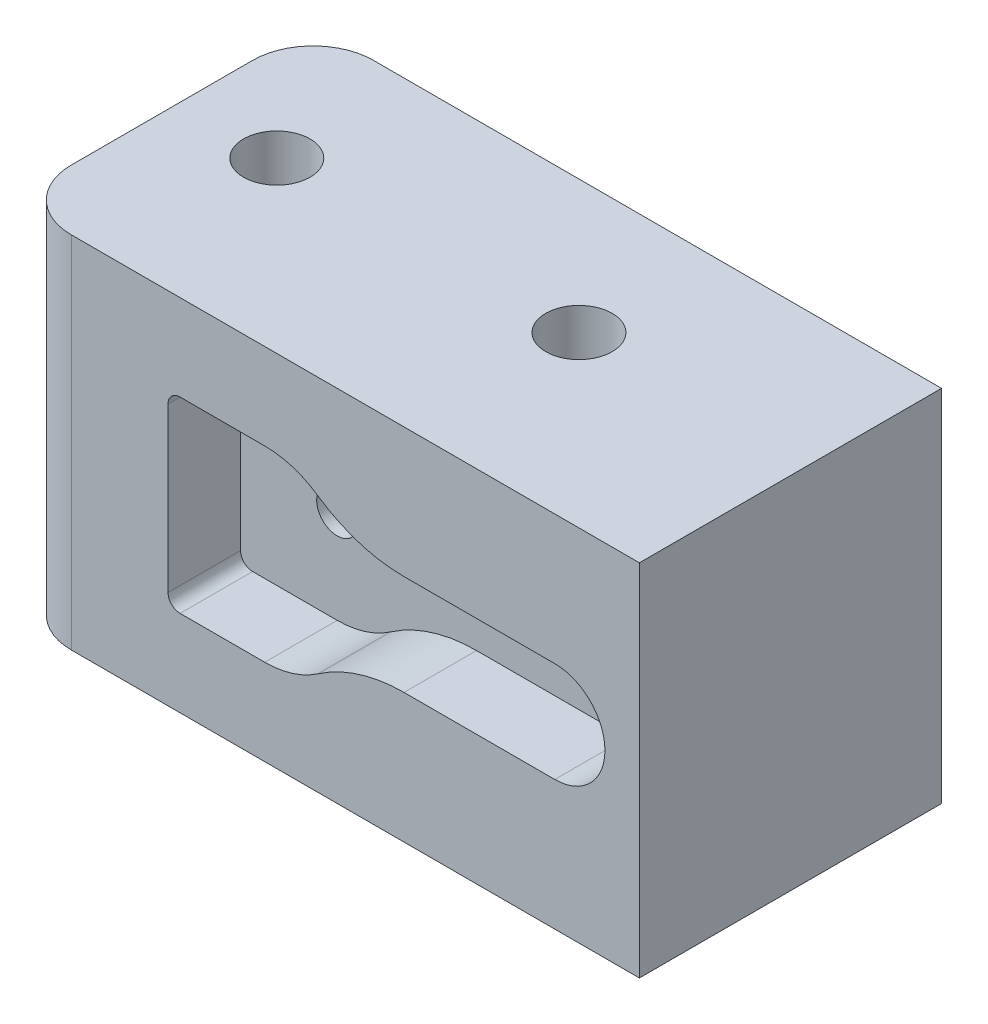
ISO-10303-21;
HEADER;
FILE_DESCRIPTION(('STEP AP214'),'2;1');
FILE_NAME('part.step','',(''),(''),'','','');
FILE_SCHEMA(('AUTOMOTIVE_DESIGN { 1 0 10303 214 1 1 1 1 }'));
ENDSEC;
DATA;
#1=APPLICATION_CONTEXT('core data for automotive mechanical design processes');
#2=APPLICATION_PROTOCOL_DEFINITION('international standard','automotive_design',2000,#1);
#3=PRODUCT_CONTEXT('',#1,'mechanical');
#4=PRODUCT('Part','Part','',(#3));
#5=PRODUCT_RELATED_PRODUCT_CATEGORY('part','',(#4));
#6=PRODUCT_DEFINITION_FORMATION('','',#4);
#7=PRODUCT_DEFINITION_CONTEXT('part definition',#1,'design');
#8=PRODUCT_DEFINITION('design','',#6,#7);
#9=PRODUCT_DEFINITION_SHAPE('','',#8);
#10=(LENGTH_UNIT() NAMED_UNIT(*) SI_UNIT(.MILLI.,.METRE.));
#11=(NAMED_UNIT(*) PLANE_ANGLE_UNIT() SI_UNIT($,.RADIAN.));
#12=(NAMED_UNIT(*) SI_UNIT($,.STERADIAN.) SOLID_ANGLE_UNIT());
#13=UNCERTAINTY_MEASURE_WITH_UNIT(LENGTH_MEASURE(1.E-05),#10,'distance_accuracy_value','');
#14=(GEOMETRIC_REPRESENTATION_CONTEXT(3) GLOBAL_UNCERTAINTY_ASSIGNED_CONTEXT((#13)) GLOBAL_UNIT_ASSIGNED_CONTEXT((#10,
#11,#12)) REPRESENTATION_CONTEXT('',''));
#15=CARTESIAN_POINT('',(0.,0.,0.));
#16=DIRECTION('',(0.,0.,1.));
#17=DIRECTION('',(1.,0.,0.));
#18=AXIS2_PLACEMENT_3D('',#15,#16,#17);
#19=CARTESIAN_POINT('',(19.,14.875,-12.501));
#20=DIRECTION('',(0.,0.,1.));
#21=DIRECTION('',(1.,0.,0.));
#22=AXIS2_PLACEMENT_3D('',#19,#20,#21);
#23=CYLINDRICAL_SURFACE('',#22,1.7);
#24=CARTESIAN_POINT('',(19.,14.875,6.5));
#25=DIRECTION('',(0.,0.,1.));
#26=DIRECTION('',(1.,0.,0.));
#27=AXIS2_PLACEMENT_3D('',#24,#25,#26);
#28=CIRCLE('',#27,1.7);
#29=CARTESIAN_POINT('',(20.7,14.875,6.5));
#30=VERTEX_POINT('',#29);
#31=EDGE_CURVE('E320',#30,#30,#28,.T.);
#32=ORIENTED_EDGE('',*,*,#31,.T.);
#33=EDGE_LOOP('',(#32));
#34=FACE_BOUND('',#33,.T.);
#35=CARTESIAN_POINT('',(19.,14.875,-4.5));
#36=DIRECTION('',(0.,0.,-1.));
#37=DIRECTION('',(-1.,0.,0.));
#38=AXIS2_PLACEMENT_3D('',#35,#36,#37);
#39=CIRCLE('',#38,1.7);
#40=CARTESIAN_POINT('',(17.3,14.875,-4.5));
#41=VERTEX_POINT('',#40);
#42=EDGE_CURVE('E42',#41,#41,#39,.F.);
#43=ORIENTED_EDGE('',*,*,#42,.F.);
#44=EDGE_LOOP('',(#43));
#45=FACE_BOUND('',#44,.T.);
#46=ADVANCED_FACE('F38',(#34,#45),#23,.F.);
#47=CARTESIAN_POINT('',(-5.,14.875,-12.501));
#48=DIRECTION('',(0.,0.,1.));
#49=DIRECTION('',(1.,0.,0.));
#50=AXIS2_PLACEMENT_3D('',#47,#48,#49);
#51=CYLINDRICAL_SURFACE('',#50,1.7);
#52=CARTESIAN_POINT('',(-5.,14.875,6.5));
#53=DIRECTION('',(0.,0.,1.));
#54=DIRECTION('',(1.,0.,0.));
#55=AXIS2_PLACEMENT_3D('',#52,#53,#54);
#56=CIRCLE('',#55,1.7);
#57=CARTESIAN_POINT('',(-3.3,14.875,6.5));
#58=VERTEX_POINT('',#57);
#59=EDGE_CURVE('E335',#58,#58,#56,.T.);
#60=ORIENTED_EDGE('',*,*,#59,.T.);
#61=EDGE_LOOP('',(#60));
#62=FACE_BOUND('',#61,.T.);
#63=CARTESIAN_POINT('',(-5.,14.875,-4.5));
#64=DIRECTION('',(0.,0.,-1.));
#65=DIRECTION('',(-1.,0.,0.));
#66=AXIS2_PLACEMENT_3D('',#63,#64,#65);
#67=CIRCLE('',#66,1.7);
#68=CARTESIAN_POINT('',(-6.7,14.875,-4.5));
#69=VERTEX_POINT('',#68);
#70=EDGE_CURVE('E314',#69,#69,#67,.F.);
#71=ORIENTED_EDGE('',*,*,#70,.F.);
#72=EDGE_LOOP('',(#71));
#73=FACE_BOUND('',#72,.T.);
#74=ADVANCED_FACE('F389',(#62,#73),#51,.F.);
#75=CARTESIAN_POINT('',(-26.,29.75,12.5));
#76=DIRECTION('',(0.,0.,-1.));
#77=DIRECTION('',(-1.,0.,0.));
#78=AXIS2_PLACEMENT_3D('',#75,#76,#77);
#79=PLANE('',#78);
#80=DIRECTION('',(-1.,0.,0.));
#81=VECTOR('',#80,1.);
#82=CARTESIAN_POINT('',(-5.,22.625,12.5));
#83=LINE('',#82,#81);
#84=CARTESIAN_POINT('',(-5.,22.625,12.5));
#85=VERTEX_POINT('',#84);
#86=CARTESIAN_POINT('',(-12.,22.625,12.5));
#87=VERTEX_POINT('',#86);
#88=EDGE_CURVE('E227',#85,#87,#83,.T.);
#89=ORIENTED_EDGE('',*,*,#88,.F.);
#90=CARTESIAN_POINT('',(-5.,14.875,12.5));
#91=DIRECTION('',(0.,0.,1.));
#92=DIRECTION('',(1.,0.,0.));
#93=AXIS2_PLACEMENT_3D('',#90,#91,#92);
#94=CIRCLE('',#93,7.75);
#95=CARTESIAN_POINT('',(-0.588958858657368,21.2472222222222,12.5));
#96=VERTEX_POINT('',#95);
#97=EDGE_CURVE('E174',#96,#85,#94,.T.);
#98=ORIENTED_EDGE('',*,*,#97,.F.);
#99=CARTESIAN_POINT('',(6.52562362737913,31.525,12.5));
#100=DIRECTION('',(0.,0.,-1.));
#101=DIRECTION('',(1.,0.,0.));
#102=AXIS2_PLACEMENT_3D('',#99,#100,#101);
#103=CIRCLE('',#102,12.5);
#104=CARTESIAN_POINT('',(6.52562362737913,19.025,12.5));
#105=VERTEX_POINT('',#104);
#106=EDGE_CURVE('E192',#105,#96,#103,.T.);
#107=ORIENTED_EDGE('',*,*,#106,.F.);
#108=DIRECTION('',(-1.,0.,0.));
#109=VECTOR('',#108,1.);
#110=CARTESIAN_POINT('',(19.,19.025,12.5));
#111=LINE('',#110,#109);
#112=CARTESIAN_POINT('',(19.,19.025,12.5));
#113=VERTEX_POINT('',#112);
#114=EDGE_CURVE('E195',#113,#105,#111,.T.);
#115=ORIENTED_EDGE('',*,*,#114,.F.);
#116=CARTESIAN_POINT('',(19.,14.875,12.5));
#117=DIRECTION('',(0.,0.,1.));
#118=DIRECTION('',(1.,0.,0.));
#119=AXIS2_PLACEMENT_3D('',#116,#117,#118);
#120=CIRCLE('',#119,4.15);
#121=CARTESIAN_POINT('',(19.,10.725,12.5));
#122=VERTEX_POINT('',#121);
#123=EDGE_CURVE('E251',#122,#113,#120,.T.);
#124=ORIENTED_EDGE('',*,*,#123,.F.);
#125=DIRECTION('',(1.,0.,0.));
#126=VECTOR('',#125,1.);
#127=CARTESIAN_POINT('',(19.,10.725,12.5));
#128=LINE('',#127,#126);
#129=CARTESIAN_POINT('',(6.52562362737912,10.725,12.5));
#130=VERTEX_POINT('',#129);
#131=EDGE_CURVE('E248',#130,#122,#128,.T.);
#132=ORIENTED_EDGE('',*,*,#131,.F.);
#133=CARTESIAN_POINT('',(6.52562362737912,-1.775,12.5));
#134=DIRECTION('',(0.,0.,-1.));
#135=DIRECTION('',(-1.,0.,0.));
#136=AXIS2_PLACEMENT_3D('',#133,#134,#135);
#137=CIRCLE('',#136,12.5);
#138=CARTESIAN_POINT('',(-0.588958858657375,8.50277777777778,12.5));
#139=VERTEX_POINT('',#138);
#140=EDGE_CURVE('E245',#139,#130,#137,.T.);
#141=ORIENTED_EDGE('',*,*,#140,.F.);
#142=CARTESIAN_POINT('',(-5.,14.875,12.5));
#143=DIRECTION('',(0.,0.,1.));
#144=DIRECTION('',(1.,0.,0.));
#145=AXIS2_PLACEMENT_3D('',#142,#143,#144);
#146=CIRCLE('',#145,7.75);
#147=CARTESIAN_POINT('',(-5.,7.125,12.5));
#148=VERTEX_POINT('',#147);
#149=EDGE_CURVE('E242',#148,#139,#146,.T.);
#150=ORIENTED_EDGE('',*,*,#149,.F.);
#151=DIRECTION('',(1.,0.,0.));
#152=VECTOR('',#151,1.);
#153=CARTESIAN_POINT('',(-12.,7.125,12.5));
#154=LINE('',#153,#152);
#155=CARTESIAN_POINT('',(-12.,7.125,12.5));
#156=VERTEX_POINT('',#155);
#157=EDGE_CURVE('E239',#156,#148,#154,.T.);
#158=ORIENTED_EDGE('',*,*,#157,.F.);
#159=CARTESIAN_POINT('',(-12.,8.125,12.5));
#160=DIRECTION('',(0.,0.,1.));
#161=DIRECTION('',(-1.,0.,0.));
#162=AXIS2_PLACEMENT_3D('',#159,#160,#161);
#163=CIRCLE('',#162,1.);
#164=CARTESIAN_POINT('',(-13.,8.125,12.5));
#165=VERTEX_POINT('',#164);
#166=EDGE_CURVE('E236',#165,#156,#163,.T.);
#167=ORIENTED_EDGE('',*,*,#166,.F.);
#168=DIRECTION('',(0.,-1.,0.));
#169=VECTOR('',#168,1.);
#170=CARTESIAN_POINT('',(-13.,21.625,12.5));
#171=LINE('',#170,#169);
#172=CARTESIAN_POINT('',(-13.,21.625,12.5));
#173=VERTEX_POINT('',#172);
#174=EDGE_CURVE('E233',#173,#165,#171,.T.);
#175=ORIENTED_EDGE('',*,*,#174,.F.);
#176=CARTESIAN_POINT('',(-12.,21.625,12.5));
#177=DIRECTION('',(0.,0.,1.));
#178=DIRECTION('',(-1.,0.,0.));
#179=AXIS2_PLACEMENT_3D('',#176,#177,#178);
#180=CIRCLE('',#179,0.999999999999998);
#181=EDGE_CURVE('E230',#87,#173,#180,.T.);
#182=ORIENTED_EDGE('',*,*,#181,.F.);
#183=EDGE_LOOP('',(#89,#98,#107,#115,#124,#132,#141,#150,#158,#167,#175,#182));
#184=FACE_BOUND('',#183,.T.);
#185=DIRECTION('',(1.,0.,0.));
#186=VECTOR('',#185,1.);
#187=CARTESIAN_POINT('',(-26.,29.75,12.5));
#188=LINE('',#187,#186);
#189=CARTESIAN_POINT('',(-21.,29.75,12.5));
#190=VERTEX_POINT('',#189);
#191=CARTESIAN_POINT('',(26.,29.75,12.5));
#192=VERTEX_POINT('',#191);
#193=EDGE_CURVE('E278',#190,#192,#188,.T.);
#194=ORIENTED_EDGE('',*,*,#193,.F.);
#195=DIRECTION('',(0.,-1.,0.));
#196=VECTOR('',#195,1.);
#197=CARTESIAN_POINT('',(-21.,0.,12.5));
#198=LINE('',#197,#196);
#199=CARTESIAN_POINT('',(-21.,0.,12.5));
#200=VERTEX_POINT('',#199);
#201=EDGE_CURVE('E11',#190,#200,#198,.T.);
#202=ORIENTED_EDGE('',*,*,#201,.T.);
#203=DIRECTION('',(1.,0.,0.));
#204=VECTOR('',#203,1.);
#205=CARTESIAN_POINT('',(-26.,0.,12.5));
#206=LINE('',#205,#204);
#207=CARTESIAN_POINT('',(26.,0.,12.5));
#208=VERTEX_POINT('',#207);
#209=EDGE_CURVE('E258',#200,#208,#206,.T.);
#210=ORIENTED_EDGE('',*,*,#209,.T.);
#211=DIRECTION('',(0.,-1.,0.));
#212=VECTOR('',#211,1.);
#213=CARTESIAN_POINT('',(26.,29.75,12.5));
#214=LINE('',#213,#212);
#215=EDGE_CURVE('E300',#192,#208,#214,.T.);
#216=ORIENTED_EDGE('',*,*,#215,.F.);
#217=EDGE_LOOP('',(#194,#202,#210,#216));
#218=FACE_BOUND('',#217,.T.);
#219=ADVANCED_FACE('F368',(#184,#218),#79,.F.);
#220=CARTESIAN_POINT('',(26.,29.75,12.5));
#221=DIRECTION('',(-1.,0.,0.));
#222=DIRECTION('',(0.,0.,1.));
#223=AXIS2_PLACEMENT_3D('',#220,#221,#222);
#224=PLANE('',#223);
#225=DIRECTION('',(0.,0.,-1.));
#226=VECTOR('',#225,1.);
#227=CARTESIAN_POINT('',(26.,0.,12.5));
#228=LINE('',#227,#226);
#229=CARTESIAN_POINT('',(26.,0.,-12.5));
#230=VERTEX_POINT('',#229);
#231=EDGE_CURVE('E291',#208,#230,#228,.T.);
#232=ORIENTED_EDGE('',*,*,#231,.T.);
#233=DIRECTION('',(0.,-1.,0.));
#234=VECTOR('',#233,1.);
#235=CARTESIAN_POINT('',(26.,29.75,-12.5));
#236=LINE('',#235,#234);
#237=CARTESIAN_POINT('',(26.,29.75,-12.5));
#238=VERTEX_POINT('',#237);
#239=EDGE_CURVE('E289',#238,#230,#236,.T.);
#240=ORIENTED_EDGE('',*,*,#239,.F.);
#241=DIRECTION('',(0.,0.,-1.));
#242=VECTOR('',#241,1.);
#243=CARTESIAN_POINT('',(26.,29.75,12.5));
#244=LINE('',#243,#242);
#245=EDGE_CURVE('E280',#192,#238,#244,.T.);
#246=ORIENTED_EDGE('',*,*,#245,.F.);
#247=ORIENTED_EDGE('',*,*,#215,.T.);
#248=EDGE_LOOP('',(#232,#240,#246,#247));
#249=FACE_BOUND('',#248,.T.);
#250=ADVANCED_FACE('F374',(#249),#224,.F.);
#251=CARTESIAN_POINT('',(-26.,29.75,-12.5));
#252=DIRECTION('',(0.,0.,-1.));
#253=DIRECTION('',(-1.,0.,0.));
#254=AXIS2_PLACEMENT_3D('',#251,#252,#253);
#255=PLANE('',#254);
#256=CARTESIAN_POINT('',(19.,14.875,-12.5));
#257=DIRECTION('',(0.,0.,-1.));
#258=DIRECTION('',(-1.,0.,0.));
#259=AXIS2_PLACEMENT_3D('',#256,#257,#258);
#260=CIRCLE('',#259,3.5);
#261=CARTESIAN_POINT('',(15.5,14.875,-12.5));
#262=VERTEX_POINT('',#261);
#263=EDGE_CURVE('E322',#262,#262,#260,.T.);
#264=ORIENTED_EDGE('',*,*,#263,.F.);
#265=EDGE_LOOP('',(#264));
#266=FACE_BOUND('',#265,.T.);
#267=CARTESIAN_POINT('',(-5.,14.875,-12.5));
#268=DIRECTION('',(0.,0.,-1.));
#269=DIRECTION('',(-1.,0.,0.));
#270=AXIS2_PLACEMENT_3D('',#267,#268,#269);
#271=CIRCLE('',#270,3.5);
#272=CARTESIAN_POINT('',(-8.5,14.875,-12.5));
#273=VERTEX_POINT('',#272);
#274=EDGE_CURVE('E332',#273,#273,#271,.T.);
#275=ORIENTED_EDGE('',*,*,#274,.F.);
#276=EDGE_LOOP('',(#275));
#277=FACE_BOUND('',#276,.T.);
#278=DIRECTION('',(1.,0.,0.));
#279=VECTOR('',#278,1.);
#280=CARTESIAN_POINT('',(-26.,0.,-12.5));
#281=LINE('',#280,#279);
#282=CARTESIAN_POINT('',(-21.,0.,-12.5));
#283=VERTEX_POINT('',#282);
#284=EDGE_CURVE('E294',#283,#230,#281,.T.);
#285=ORIENTED_EDGE('',*,*,#284,.F.);
#286=DIRECTION('',(0.,-1.,0.));
#287=VECTOR('',#286,1.);
#288=CARTESIAN_POINT('',(-21.,29.75,-12.5));
#289=LINE('',#288,#287);
#290=CARTESIAN_POINT('',(-21.,29.75,-12.5));
#291=VERTEX_POINT('',#290);
#292=EDGE_CURVE('E63',#283,#291,#289,.F.);
#293=ORIENTED_EDGE('',*,*,#292,.T.);
#294=DIRECTION('',(1.,0.,0.));
#295=VECTOR('',#294,1.);
#296=CARTESIAN_POINT('',(-26.,29.75,-12.5));
#297=LINE('',#296,#295);
#298=EDGE_CURVE('E284',#291,#238,#297,.T.);
#299=ORIENTED_EDGE('',*,*,#298,.T.);
#300=ORIENTED_EDGE('',*,*,#239,.T.);
#301=EDGE_LOOP('',(#285,#293,#299,#300));
#302=FACE_BOUND('',#301,.T.);
#303=ADVANCED_FACE('F454',(#266,#277,#302),#255,.T.);
#304=CARTESIAN_POINT('',(-26.,29.75,12.5));
#305=DIRECTION('',(-1.,0.,0.));
#306=DIRECTION('',(0.,0.,1.));
#307=AXIS2_PLACEMENT_3D('',#304,#305,#306);
#308=PLANE('',#307);
#309=DIRECTION('',(0.,0.,-1.));
#310=VECTOR('',#309,1.);
#311=CARTESIAN_POINT('',(-26.,29.75,12.5));
#312=LINE('',#311,#310);
#313=CARTESIAN_POINT('',(-26.,29.75,7.50000000000001));
#314=VERTEX_POINT('',#313);
#315=CARTESIAN_POINT('',(-26.,29.75,-7.49999999999999));
#316=VERTEX_POINT('',#315);
#317=EDGE_CURVE('E286',#314,#316,#312,.T.);
#318=ORIENTED_EDGE('',*,*,#317,.T.);
#319=DIRECTION('',(0.,-1.,0.));
#320=VECTOR('',#319,1.);
#321=CARTESIAN_POINT('',(-26.,29.75,-7.49999999999999));
#322=LINE('',#321,#320);
#323=CARTESIAN_POINT('',(-26.,0.,-7.49999999999999));
#324=VERTEX_POINT('',#323);
#325=EDGE_CURVE('E305',#316,#324,#322,.T.);
#326=ORIENTED_EDGE('',*,*,#325,.T.);
#327=DIRECTION('',(0.,0.,-1.));
#328=VECTOR('',#327,1.);
#329=CARTESIAN_POINT('',(-26.,0.,12.5));
#330=LINE('',#329,#328);
#331=CARTESIAN_POINT('',(-26.,0.,7.50000000000001));
#332=VERTEX_POINT('',#331);
#333=EDGE_CURVE('E281',#332,#324,#330,.T.);
#334=ORIENTED_EDGE('',*,*,#333,.F.);
#335=DIRECTION('',(0.,-1.,0.));
#336=VECTOR('',#335,1.);
#337=CARTESIAN_POINT('',(-26.,29.75,7.50000000000001));
#338=LINE('',#337,#336);
#339=EDGE_CURVE('E303',#332,#314,#338,.F.);
#340=ORIENTED_EDGE('',*,*,#339,.T.);
#341=EDGE_LOOP('',(#318,#326,#334,#340));
#342=FACE_BOUND('',#341,.T.);
#343=ADVANCED_FACE('F363',(#342),#308,.T.);
#344=CARTESIAN_POINT('',(0.,29.75,0.));
#345=DIRECTION('',(0.,1.,0.));
#346=DIRECTION('',(0.,0.,1.));
#347=AXIS2_PLACEMENT_3D('',#344,#345,#346);
#348=PLANE('',#347);
#349=CARTESIAN_POINT('',(-18.,29.75,-1.49999999999999));
#350=DIRECTION('',(0.,1.,0.));
#351=DIRECTION('',(0.,0.,1.));
#352=AXIS2_PLACEMENT_3D('',#349,#350,#351);
#353=CIRCLE('',#352,2.75);
#354=CARTESIAN_POINT('',(-18.,29.75,1.25));
#355=VERTEX_POINT('',#354);
#356=EDGE_CURVE('E341',#355,#355,#353,.T.);
#357=ORIENTED_EDGE('',*,*,#356,.F.);
#358=EDGE_LOOP('',(#357));
#359=FACE_BOUND('',#358,.T.);
#360=CARTESIAN_POINT('',(7.,29.75,-1.5));
#361=DIRECTION('',(0.,1.,0.));
#362=DIRECTION('',(0.,0.,1.));
#363=AXIS2_PLACEMENT_3D('',#360,#361,#362);
#364=CIRCLE('',#363,2.75);
#365=CARTESIAN_POINT('',(7.,29.75,1.25));
#366=VERTEX_POINT('',#365);
#367=EDGE_CURVE('E338',#366,#366,#364,.T.);
#368=ORIENTED_EDGE('',*,*,#367,.F.);
#369=EDGE_LOOP('',(#368));
#370=FACE_BOUND('',#369,.T.);
#371=ORIENTED_EDGE('',*,*,#298,.F.);
#372=CARTESIAN_POINT('',(-21.,29.75,-7.49999999999999));
#373=DIRECTION('',(0.,1.,0.));
#374=DIRECTION('',(0.,0.,1.));
#375=AXIS2_PLACEMENT_3D('',#372,#373,#374);
#376=CIRCLE('',#375,5.);
#377=EDGE_CURVE('E47',#291,#316,#376,.T.);
#378=ORIENTED_EDGE('',*,*,#377,.T.);
#379=ORIENTED_EDGE('',*,*,#317,.F.);
#380=CARTESIAN_POINT('',(-21.,29.75,7.50000000000001));
#381=DIRECTION('',(0.,1.,0.));
#382=DIRECTION('',(0.,0.,1.));
#383=AXIS2_PLACEMENT_3D('',#380,#381,#382);
#384=CIRCLE('',#383,5.);
#385=EDGE_CURVE('E55',#314,#190,#384,.T.);
#386=ORIENTED_EDGE('',*,*,#385,.T.);
#387=ORIENTED_EDGE('',*,*,#193,.T.);
#388=ORIENTED_EDGE('',*,*,#245,.T.);
#389=EDGE_LOOP('',(#371,#378,#379,#386,#387,#388));
#390=FACE_BOUND('',#389,.T.);
#391=ADVANCED_FACE('F356',(#359,#370,#390),#348,.T.);
#392=CARTESIAN_POINT('',(0.,0.,0.));
#393=DIRECTION('',(0.,1.,0.));
#394=DIRECTION('',(0.,0.,1.));
#395=AXIS2_PLACEMENT_3D('',#392,#393,#394);
#396=PLANE('',#395);
#397=CARTESIAN_POINT('',(-18.,0.,-1.49999999999999));
#398=DIRECTION('',(0.,1.,0.));
#399=DIRECTION('',(0.,0.,1.));
#400=AXIS2_PLACEMENT_3D('',#397,#398,#399);
#401=CIRCLE('',#400,2.75);
#402=CARTESIAN_POINT('',(-18.,0.,1.25));
#403=VERTEX_POINT('',#402);
#404=EDGE_CURVE('E228',#403,#403,#401,.F.);
#405=ORIENTED_EDGE('',*,*,#404,.F.);
#406=EDGE_LOOP('',(#405));
#407=FACE_BOUND('',#406,.T.);
#408=CARTESIAN_POINT('',(7.,0.,-1.5));
#409=DIRECTION('',(0.,1.,0.));
#410=DIRECTION('',(0.,0.,1.));
#411=AXIS2_PLACEMENT_3D('',#408,#409,#410);
#412=CIRCLE('',#411,2.75);
#413=CARTESIAN_POINT('',(7.,0.,1.25));
#414=VERTEX_POINT('',#413);
#415=EDGE_CURVE('E198',#414,#414,#412,.F.);
#416=ORIENTED_EDGE('',*,*,#415,.F.);
#417=EDGE_LOOP('',(#416));
#418=FACE_BOUND('',#417,.T.);
#419=ORIENTED_EDGE('',*,*,#333,.T.);
#420=CARTESIAN_POINT('',(-21.,0.,-7.49999999999999));
#421=DIRECTION('',(0.,1.,0.));
#422=DIRECTION('',(0.,0.,1.));
#423=AXIS2_PLACEMENT_3D('',#420,#421,#422);
#424=CIRCLE('',#423,5.);
#425=EDGE_CURVE('E310',#324,#283,#424,.F.);
#426=ORIENTED_EDGE('',*,*,#425,.T.);
#427=ORIENTED_EDGE('',*,*,#284,.T.);
#428=ORIENTED_EDGE('',*,*,#231,.F.);
#429=ORIENTED_EDGE('',*,*,#209,.F.);
#430=CARTESIAN_POINT('',(-21.,0.,7.50000000000001));
#431=DIRECTION('',(0.,1.,0.));
#432=DIRECTION('',(0.,0.,1.));
#433=AXIS2_PLACEMENT_3D('',#430,#431,#432);
#434=CIRCLE('',#433,5.);
#435=EDGE_CURVE('E308',#200,#332,#434,.F.);
#436=ORIENTED_EDGE('',*,*,#435,.T.);
#437=EDGE_LOOP('',(#419,#426,#427,#428,#429,#436));
#438=FACE_BOUND('',#437,.T.);
#439=ADVANCED_FACE('F353',(#407,#418,#438),#396,.F.);
#440=CARTESIAN_POINT('',(-5.,14.875,6.5));
#441=DIRECTION('',(0.,0.,1.));
#442=DIRECTION('',(1.,0.,0.));
#443=AXIS2_PLACEMENT_3D('',#440,#441,#442);
#444=CYLINDRICAL_SURFACE('',#443,7.75);
#445=ORIENTED_EDGE('',*,*,#97,.T.);
#446=DIRECTION('',(0.,0.,1.));
#447=VECTOR('',#446,1.);
#448=CARTESIAN_POINT('',(-5.,22.625,6.5));
#449=LINE('',#448,#447);
#450=CARTESIAN_POINT('',(-5.,22.625,6.5));
#451=VERTEX_POINT('',#450);
#452=EDGE_CURVE('E167',#451,#85,#449,.T.);
#453=ORIENTED_EDGE('',*,*,#452,.F.);
#454=CARTESIAN_POINT('',(-5.,14.875,6.5));
#455=DIRECTION('',(0.,0.,1.));
#456=DIRECTION('',(1.,0.,0.));
#457=AXIS2_PLACEMENT_3D('',#454,#455,#456);
#458=CIRCLE('',#457,7.75);
#459=CARTESIAN_POINT('',(-0.588958858657368,21.2472222222222,6.5));
#460=VERTEX_POINT('',#459);
#461=EDGE_CURVE('E171',#460,#451,#458,.T.);
#462=ORIENTED_EDGE('',*,*,#461,.F.);
#463=DIRECTION('',(0.,0.,1.));
#464=VECTOR('',#463,1.);
#465=CARTESIAN_POINT('',(-0.588958858657368,21.2472222222222,6.5));
#466=LINE('',#465,#464);
#467=EDGE_CURVE('E256',#460,#96,#466,.T.);
#468=ORIENTED_EDGE('',*,*,#467,.T.);
#469=EDGE_LOOP('',(#445,#453,#462,#468));
#470=FACE_BOUND('',#469,.T.);
#471=ADVANCED_FACE('F169',(#470),#444,.F.);
#472=CARTESIAN_POINT('',(6.52562362737913,31.525,6.5));
#473=DIRECTION('',(0.,0.,1.));
#474=DIRECTION('',(1.,0.,0.));
#475=AXIS2_PLACEMENT_3D('',#472,#473,#474);
#476=CYLINDRICAL_SURFACE('',#475,12.5);
#477=ORIENTED_EDGE('',*,*,#106,.T.);
#478=ORIENTED_EDGE('',*,*,#467,.F.);
#479=CARTESIAN_POINT('',(6.52562362737913,31.525,6.5));
#480=DIRECTION('',(0.,0.,-1.));
#481=DIRECTION('',(1.,0.,0.));
#482=AXIS2_PLACEMENT_3D('',#479,#480,#481);
#483=CIRCLE('',#482,12.5);
#484=CARTESIAN_POINT('',(6.52562362737913,19.025,6.5));
#485=VERTEX_POINT('',#484);
#486=EDGE_CURVE('E179',#485,#460,#483,.T.);
#487=ORIENTED_EDGE('',*,*,#486,.F.);
#488=DIRECTION('',(0.,0.,1.));
#489=VECTOR('',#488,1.);
#490=CARTESIAN_POINT('',(6.52562362737913,19.025,6.5));
#491=LINE('',#490,#489);
#492=EDGE_CURVE('E259',#485,#105,#491,.T.);
#493=ORIENTED_EDGE('',*,*,#492,.T.);
#494=EDGE_LOOP('',(#477,#478,#487,#493));
#495=FACE_BOUND('',#494,.T.);
#496=ADVANCED_FACE('F405',(#495),#476,.T.);
#497=CARTESIAN_POINT('',(19.,19.025,6.5));
#498=DIRECTION('',(0.,1.,0.));
#499=DIRECTION('',(0.,0.,1.));
#500=AXIS2_PLACEMENT_3D('',#497,#498,#499);
#501=PLANE('',#500);
#502=ORIENTED_EDGE('',*,*,#114,.T.);
#503=ORIENTED_EDGE('',*,*,#492,.F.);
#504=DIRECTION('',(-1.,0.,0.));
#505=VECTOR('',#504,1.);
#506=CARTESIAN_POINT('',(19.,19.025,6.5));
#507=LINE('',#506,#505);
#508=CARTESIAN_POINT('',(19.,19.025,6.5));
#509=VERTEX_POINT('',#508);
#510=EDGE_CURVE('E223',#509,#485,#507,.T.);
#511=ORIENTED_EDGE('',*,*,#510,.F.);
#512=DIRECTION('',(0.,0.,1.));
#513=VECTOR('',#512,1.);
#514=CARTESIAN_POINT('',(19.,19.025,6.5));
#515=LINE('',#514,#513);
#516=EDGE_CURVE('E261',#509,#113,#515,.T.);
#517=ORIENTED_EDGE('',*,*,#516,.T.);
#518=EDGE_LOOP('',(#502,#503,#511,#517));
#519=FACE_BOUND('',#518,.T.);
#520=ADVANCED_FACE('F408',(#519),#501,.F.);
#521=CARTESIAN_POINT('',(19.,14.875,6.5));
#522=DIRECTION('',(0.,0.,1.));
#523=DIRECTION('',(1.,0.,0.));
#524=AXIS2_PLACEMENT_3D('',#521,#522,#523);
#525=CYLINDRICAL_SURFACE('',#524,4.15);
#526=ORIENTED_EDGE('',*,*,#123,.T.);
#527=ORIENTED_EDGE('',*,*,#516,.F.);
#528=CARTESIAN_POINT('',(19.,14.875,6.5));
#529=DIRECTION('',(0.,0.,1.));
#530=DIRECTION('',(1.,0.,0.));
#531=AXIS2_PLACEMENT_3D('',#528,#529,#530);
#532=CIRCLE('',#531,4.15);
#533=CARTESIAN_POINT('',(19.,10.725,6.5));
#534=VERTEX_POINT('',#533);
#535=EDGE_CURVE('E220',#534,#509,#532,.T.);
#536=ORIENTED_EDGE('',*,*,#535,.F.);
#537=DIRECTION('',(0.,0.,1.));
#538=VECTOR('',#537,1.);
#539=CARTESIAN_POINT('',(19.,10.725,6.5));
#540=LINE('',#539,#538);
#541=EDGE_CURVE('E263',#534,#122,#540,.T.);
#542=ORIENTED_EDGE('',*,*,#541,.T.);
#543=EDGE_LOOP('',(#526,#527,#536,#542));
#544=FACE_BOUND('',#543,.T.);
#545=ADVANCED_FACE('F412',(#544),#525,.F.);
#546=CARTESIAN_POINT('',(19.,10.725,6.5));
#547=DIRECTION('',(0.,-1.,0.));
#548=DIRECTION('',(0.,0.,-1.));
#549=AXIS2_PLACEMENT_3D('',#546,#547,#548);
#550=PLANE('',#549);
#551=ORIENTED_EDGE('',*,*,#131,.T.);
#552=ORIENTED_EDGE('',*,*,#541,.F.);
#553=DIRECTION('',(1.,0.,0.));
#554=VECTOR('',#553,1.);
#555=CARTESIAN_POINT('',(19.,10.725,6.5));
#556=LINE('',#555,#554);
#557=CARTESIAN_POINT('',(6.52562362737912,10.725,6.5));
#558=VERTEX_POINT('',#557);
#559=EDGE_CURVE('E217',#558,#534,#556,.T.);
#560=ORIENTED_EDGE('',*,*,#559,.F.);
#561=DIRECTION('',(0.,0.,1.));
#562=VECTOR('',#561,1.);
#563=CARTESIAN_POINT('',(6.52562362737912,10.725,6.5));
#564=LINE('',#563,#562);
#565=EDGE_CURVE('E265',#558,#130,#564,.T.);
#566=ORIENTED_EDGE('',*,*,#565,.T.);
#567=EDGE_LOOP('',(#551,#552,#560,#566));
#568=FACE_BOUND('',#567,.T.);
#569=ADVANCED_FACE('F416',(#568),#550,.F.);
#570=CARTESIAN_POINT('',(6.52562362737912,-1.775,6.5));
#571=DIRECTION('',(0.,0.,1.));
#572=DIRECTION('',(1.,0.,0.));
#573=AXIS2_PLACEMENT_3D('',#570,#571,#572);
#574=CYLINDRICAL_SURFACE('',#573,12.5);
#575=ORIENTED_EDGE('',*,*,#140,.T.);
#576=ORIENTED_EDGE('',*,*,#565,.F.);
#577=CARTESIAN_POINT('',(6.52562362737912,-1.775,6.5));
#578=DIRECTION('',(0.,0.,-1.));
#579=DIRECTION('',(-1.,0.,0.));
#580=AXIS2_PLACEMENT_3D('',#577,#578,#579);
#581=CIRCLE('',#580,12.5);
#582=CARTESIAN_POINT('',(-0.588958858657375,8.50277777777778,6.5));
#583=VERTEX_POINT('',#582);
#584=EDGE_CURVE('E214',#583,#558,#581,.T.);
#585=ORIENTED_EDGE('',*,*,#584,.F.);
#586=DIRECTION('',(0.,0.,1.));
#587=VECTOR('',#586,1.);
#588=CARTESIAN_POINT('',(-0.588958858657375,8.50277777777778,6.5));
#589=LINE('',#588,#587);
#590=EDGE_CURVE('E267',#583,#139,#589,.T.);
#591=ORIENTED_EDGE('',*,*,#590,.T.);
#592=EDGE_LOOP('',(#575,#576,#585,#591));
#593=FACE_BOUND('',#592,.T.);
#594=ADVANCED_FACE('F420',(#593),#574,.T.);
#595=CARTESIAN_POINT('',(-5.,14.875,6.5));
#596=DIRECTION('',(0.,0.,1.));
#597=DIRECTION('',(1.,0.,0.));
#598=AXIS2_PLACEMENT_3D('',#595,#596,#597);
#599=CYLINDRICAL_SURFACE('',#598,7.75);
#600=ORIENTED_EDGE('',*,*,#149,.T.);
#601=ORIENTED_EDGE('',*,*,#590,.F.);
#602=CARTESIAN_POINT('',(-5.,14.875,6.5));
#603=DIRECTION('',(0.,0.,1.));
#604=DIRECTION('',(1.,0.,0.));
#605=AXIS2_PLACEMENT_3D('',#602,#603,#604);
#606=CIRCLE('',#605,7.75);
#607=CARTESIAN_POINT('',(-5.,7.125,6.5));
#608=VERTEX_POINT('',#607);
#609=EDGE_CURVE('E211',#608,#583,#606,.T.);
#610=ORIENTED_EDGE('',*,*,#609,.F.);
#611=DIRECTION('',(0.,0.,1.));
#612=VECTOR('',#611,1.);
#613=CARTESIAN_POINT('',(-5.,7.125,6.5));
#614=LINE('',#613,#612);
#615=EDGE_CURVE('E269',#608,#148,#614,.T.);
#616=ORIENTED_EDGE('',*,*,#615,.T.);
#617=EDGE_LOOP('',(#600,#601,#610,#616));
#618=FACE_BOUND('',#617,.T.);
#619=ADVANCED_FACE('F424',(#618),#599,.F.);
#620=CARTESIAN_POINT('',(-12.,7.125,6.5));
#621=DIRECTION('',(0.,-1.,0.));
#622=DIRECTION('',(0.,0.,-1.));
#623=AXIS2_PLACEMENT_3D('',#620,#621,#622);
#624=PLANE('',#623);
#625=ORIENTED_EDGE('',*,*,#157,.T.);
#626=ORIENTED_EDGE('',*,*,#615,.F.);
#627=DIRECTION('',(1.,0.,0.));
#628=VECTOR('',#627,1.);
#629=CARTESIAN_POINT('',(-12.,7.125,6.5));
#630=LINE('',#629,#628);
#631=CARTESIAN_POINT('',(-12.,7.125,6.5));
#632=VERTEX_POINT('',#631);
#633=EDGE_CURVE('E208',#632,#608,#630,.T.);
#634=ORIENTED_EDGE('',*,*,#633,.F.);
#635=DIRECTION('',(0.,0.,1.));
#636=VECTOR('',#635,1.);
#637=CARTESIAN_POINT('',(-12.,7.125,6.5));
#638=LINE('',#637,#636);
#639=EDGE_CURVE('E271',#632,#156,#638,.T.);
#640=ORIENTED_EDGE('',*,*,#639,.T.);
#641=EDGE_LOOP('',(#625,#626,#634,#640));
#642=FACE_BOUND('',#641,.T.);
#643=ADVANCED_FACE('F428',(#642),#624,.F.);
#644=CARTESIAN_POINT('',(-12.,8.125,6.5));
#645=DIRECTION('',(0.,0.,1.));
#646=DIRECTION('',(1.,0.,0.));
#647=AXIS2_PLACEMENT_3D('',#644,#645,#646);
#648=CYLINDRICAL_SURFACE('',#647,1.);
#649=ORIENTED_EDGE('',*,*,#166,.T.);
#650=ORIENTED_EDGE('',*,*,#639,.F.);
#651=CARTESIAN_POINT('',(-12.,8.125,6.5));
#652=DIRECTION('',(0.,0.,1.));
#653=DIRECTION('',(-1.,0.,0.));
#654=AXIS2_PLACEMENT_3D('',#651,#652,#653);
#655=CIRCLE('',#654,1.);
#656=CARTESIAN_POINT('',(-13.,8.125,6.5));
#657=VERTEX_POINT('',#656);
#658=EDGE_CURVE('E205',#657,#632,#655,.T.);
#659=ORIENTED_EDGE('',*,*,#658,.F.);
#660=DIRECTION('',(0.,0.,1.));
#661=VECTOR('',#660,1.);
#662=CARTESIAN_POINT('',(-13.,8.125,6.5));
#663=LINE('',#662,#661);
#664=EDGE_CURVE('E273',#657,#165,#663,.T.);
#665=ORIENTED_EDGE('',*,*,#664,.T.);
#666=EDGE_LOOP('',(#649,#650,#659,#665));
#667=FACE_BOUND('',#666,.T.);
#668=ADVANCED_FACE('F432',(#667),#648,.F.);
#669=CARTESIAN_POINT('',(-13.,21.625,6.5));
#670=DIRECTION('',(-1.,0.,0.));
#671=DIRECTION('',(0.,-1.,0.));
#672=AXIS2_PLACEMENT_3D('',#669,#670,#671);
#673=PLANE('',#672);
#674=ORIENTED_EDGE('',*,*,#174,.T.);
#675=ORIENTED_EDGE('',*,*,#664,.F.);
#676=DIRECTION('',(0.,-1.,0.));
#677=VECTOR('',#676,1.);
#678=CARTESIAN_POINT('',(-13.,21.625,6.5));
#679=LINE('',#678,#677);
#680=CARTESIAN_POINT('',(-13.,21.625,6.5));
#681=VERTEX_POINT('',#680);
#682=EDGE_CURVE('E202',#681,#657,#679,.T.);
#683=ORIENTED_EDGE('',*,*,#682,.F.);
#684=DIRECTION('',(0.,0.,1.));
#685=VECTOR('',#684,1.);
#686=CARTESIAN_POINT('',(-13.,21.625,6.5));
#687=LINE('',#686,#685);
#688=EDGE_CURVE('E275',#681,#173,#687,.T.);
#689=ORIENTED_EDGE('',*,*,#688,.T.);
#690=EDGE_LOOP('',(#674,#675,#683,#689));
#691=FACE_BOUND('',#690,.T.);
#692=ADVANCED_FACE('F436',(#691),#673,.F.);
#693=CARTESIAN_POINT('',(-12.,21.625,6.5));
#694=DIRECTION('',(0.,0.,1.));
#695=DIRECTION('',(1.,0.,0.));
#696=AXIS2_PLACEMENT_3D('',#693,#694,#695);
#697=CYLINDRICAL_SURFACE('',#696,0.999999999999998);
#698=ORIENTED_EDGE('',*,*,#181,.T.);
#699=ORIENTED_EDGE('',*,*,#688,.F.);
#700=CARTESIAN_POINT('',(-12.,21.625,6.5));
#701=DIRECTION('',(0.,0.,1.));
#702=DIRECTION('',(-1.,0.,0.));
#703=AXIS2_PLACEMENT_3D('',#700,#701,#702);
#704=CIRCLE('',#703,0.999999999999998);
#705=CARTESIAN_POINT('',(-12.,22.625,6.5));
#706=VERTEX_POINT('',#705);
#707=EDGE_CURVE('E187',#706,#681,#704,.T.);
#708=ORIENTED_EDGE('',*,*,#707,.F.);
#709=DIRECTION('',(0.,0.,1.));
#710=VECTOR('',#709,1.);
#711=CARTESIAN_POINT('',(-12.,22.625,6.5));
#712=LINE('',#711,#710);
#713=EDGE_CURVE('E178',#706,#87,#712,.T.);
#714=ORIENTED_EDGE('',*,*,#713,.T.);
#715=EDGE_LOOP('',(#698,#699,#708,#714));
#716=FACE_BOUND('',#715,.T.);
#717=ADVANCED_FACE('F440',(#716),#697,.F.);
#718=CARTESIAN_POINT('',(-5.,22.625,6.5));
#719=DIRECTION('',(0.,1.,0.));
#720=DIRECTION('',(-1.,0.,0.));
#721=AXIS2_PLACEMENT_3D('',#718,#719,#720);
#722=PLANE('',#721);
#723=ORIENTED_EDGE('',*,*,#88,.T.);
#724=ORIENTED_EDGE('',*,*,#713,.F.);
#725=DIRECTION('',(-1.,0.,0.));
#726=VECTOR('',#725,1.);
#727=CARTESIAN_POINT('',(-5.,22.625,6.5));
#728=LINE('',#727,#726);
#729=EDGE_CURVE('E182',#451,#706,#728,.T.);
#730=ORIENTED_EDGE('',*,*,#729,.F.);
#731=ORIENTED_EDGE('',*,*,#452,.T.);
#732=EDGE_LOOP('',(#723,#724,#730,#731));
#733=FACE_BOUND('',#732,.T.);
#734=ADVANCED_FACE('F183',(#733),#722,.F.);
#735=CARTESIAN_POINT('',(-5.,14.875,6.5));
#736=DIRECTION('',(0.,0.,1.));
#737=DIRECTION('',(1.,0.,0.));
#738=AXIS2_PLACEMENT_3D('',#735,#736,#737);
#739=PLANE('',#738);
#740=ORIENTED_EDGE('',*,*,#59,.F.);
#741=EDGE_LOOP('',(#740));
#742=FACE_BOUND('',#741,.T.);
#743=ORIENTED_EDGE('',*,*,#31,.F.);
#744=EDGE_LOOP('',(#743));
#745=FACE_BOUND('',#744,.T.);
#746=ORIENTED_EDGE('',*,*,#461,.T.);
#747=ORIENTED_EDGE('',*,*,#729,.T.);
#748=ORIENTED_EDGE('',*,*,#707,.T.);
#749=ORIENTED_EDGE('',*,*,#682,.T.);
#750=ORIENTED_EDGE('',*,*,#658,.T.);
#751=ORIENTED_EDGE('',*,*,#633,.T.);
#752=ORIENTED_EDGE('',*,*,#609,.T.);
#753=ORIENTED_EDGE('',*,*,#584,.T.);
#754=ORIENTED_EDGE('',*,*,#559,.T.);
#755=ORIENTED_EDGE('',*,*,#535,.T.);
#756=ORIENTED_EDGE('',*,*,#510,.T.);
#757=ORIENTED_EDGE('',*,*,#486,.T.);
#758=EDGE_LOOP('',(#746,#747,#748,#749,#750,#751,#752,#753,#754,#755,#756,#757));
#759=FACE_BOUND('',#758,.T.);
#760=ADVANCED_FACE('F189',(#742,#745,#759),#739,.T.);
#761=CARTESIAN_POINT('',(7.,-0.001000000000001,-1.5));
#762=DIRECTION('',(0.,1.,0.));
#763=DIRECTION('',(0.,0.,1.));
#764=AXIS2_PLACEMENT_3D('',#761,#762,#763);
#765=CYLINDRICAL_SURFACE('',#764,2.75);
#766=ORIENTED_EDGE('',*,*,#367,.T.);
#767=EDGE_LOOP('',(#766));
#768=FACE_BOUND('',#767,.T.);
#769=ORIENTED_EDGE('',*,*,#415,.T.);
#770=EDGE_LOOP('',(#769));
#771=FACE_BOUND('',#770,.T.);
#772=ADVANCED_FACE('F351',(#768,#771),#765,.F.);
#773=CARTESIAN_POINT('',(-18.,-0.001000000000001,-1.49999999999999));
#774=DIRECTION('',(0.,1.,0.));
#775=DIRECTION('',(0.,0.,1.));
#776=AXIS2_PLACEMENT_3D('',#773,#774,#775);
#777=CYLINDRICAL_SURFACE('',#776,2.75);
#778=ORIENTED_EDGE('',*,*,#356,.T.);
#779=EDGE_LOOP('',(#778));
#780=FACE_BOUND('',#779,.T.);
#781=ORIENTED_EDGE('',*,*,#404,.T.);
#782=EDGE_LOOP('',(#781));
#783=FACE_BOUND('',#782,.T.);
#784=ADVANCED_FACE('F379',(#780,#783),#777,.F.);
#785=CARTESIAN_POINT('',(-21.,29.75,-7.49999999999999));
#786=DIRECTION('',(0.,-1.,0.));
#787=DIRECTION('',(0.,0.,-1.));
#788=AXIS2_PLACEMENT_3D('',#785,#786,#787);
#789=CYLINDRICAL_SURFACE('',#788,5.);
#790=ORIENTED_EDGE('',*,*,#377,.F.);
#791=ORIENTED_EDGE('',*,*,#292,.F.);
#792=ORIENTED_EDGE('',*,*,#425,.F.);
#793=ORIENTED_EDGE('',*,*,#325,.F.);
#794=EDGE_LOOP('',(#790,#791,#792,#793));
#795=FACE_BOUND('',#794,.T.);
#796=ADVANCED_FACE('F377',(#795),#789,.T.);
#797=CARTESIAN_POINT('',(-21.,29.75,7.50000000000001));
#798=DIRECTION('',(0.,1.,0.));
#799=DIRECTION('',(0.,0.,1.));
#800=AXIS2_PLACEMENT_3D('',#797,#798,#799);
#801=CYLINDRICAL_SURFACE('',#800,5.);
#802=ORIENTED_EDGE('',*,*,#385,.F.);
#803=ORIENTED_EDGE('',*,*,#339,.F.);
#804=ORIENTED_EDGE('',*,*,#435,.F.);
#805=ORIENTED_EDGE('',*,*,#201,.F.);
#806=EDGE_LOOP('',(#802,#803,#804,#805));
#807=FACE_BOUND('',#806,.T.);
#808=ADVANCED_FACE('F40',(#807),#801,.T.);
#809=CARTESIAN_POINT('',(-5.,14.875,-4.5));
#810=DIRECTION('',(0.,0.,-1.));
#811=DIRECTION('',(-1.,0.,0.));
#812=AXIS2_PLACEMENT_3D('',#809,#810,#811);
#813=PLANE('',#812);
#814=CARTESIAN_POINT('',(-5.,14.875,-4.5));
#815=DIRECTION('',(0.,0.,-1.));
#816=DIRECTION('',(-1.,0.,0.));
#817=AXIS2_PLACEMENT_3D('',#814,#815,#816);
#818=CIRCLE('',#817,3.5);
#819=CARTESIAN_POINT('',(-8.5,14.875,-4.5));
#820=VERTEX_POINT('',#819);
#821=EDGE_CURVE('E327',#820,#820,#818,.T.);
#822=ORIENTED_EDGE('',*,*,#821,.T.);
#823=EDGE_LOOP('',(#822));
#824=FACE_BOUND('',#823,.T.);
#825=ORIENTED_EDGE('',*,*,#70,.T.);
#826=EDGE_LOOP('',(#825));
#827=FACE_BOUND('',#826,.T.);
#828=ADVANCED_FACE('F384',(#824,#827),#813,.T.);
#829=CARTESIAN_POINT('',(-5.,14.875,-4.5));
#830=DIRECTION('',(0.,0.,-1.));
#831=DIRECTION('',(-1.,0.,0.));
#832=AXIS2_PLACEMENT_3D('',#829,#830,#831);
#833=CYLINDRICAL_SURFACE('',#832,3.5);
#834=ORIENTED_EDGE('',*,*,#821,.F.);
#835=EDGE_LOOP('',(#834));
#836=FACE_BOUND('',#835,.T.);
#837=ORIENTED_EDGE('',*,*,#274,.T.);
#838=EDGE_LOOP('',(#837));
#839=FACE_BOUND('',#838,.T.);
#840=ADVANCED_FACE('F592',(#836,#839),#833,.F.);
#841=CARTESIAN_POINT('',(19.,14.875,-4.5));
#842=DIRECTION('',(0.,0.,-1.));
#843=DIRECTION('',(-1.,0.,0.));
#844=AXIS2_PLACEMENT_3D('',#841,#842,#843);
#845=PLANE('',#844);
#846=CARTESIAN_POINT('',(19.,14.875,-4.5));
#847=DIRECTION('',(0.,0.,-1.));
#848=DIRECTION('',(-1.,0.,0.));
#849=AXIS2_PLACEMENT_3D('',#846,#847,#848);
#850=CIRCLE('',#849,3.5);
#851=CARTESIAN_POINT('',(15.5,14.875,-4.5));
#852=VERTEX_POINT('',#851);
#853=EDGE_CURVE('E316',#852,#852,#850,.T.);
#854=ORIENTED_EDGE('',*,*,#853,.T.);
#855=EDGE_LOOP('',(#854));
#856=FACE_BOUND('',#855,.T.);
#857=ORIENTED_EDGE('',*,*,#42,.T.);
#858=EDGE_LOOP('',(#857));
#859=FACE_BOUND('',#858,.T.);
#860=ADVANCED_FACE('F601',(#856,#859),#845,.T.);
#861=CARTESIAN_POINT('',(19.,14.875,-4.5));
#862=DIRECTION('',(0.,0.,-1.));
#863=DIRECTION('',(-1.,0.,0.));
#864=AXIS2_PLACEMENT_3D('',#861,#862,#863);
#865=CYLINDRICAL_SURFACE('',#864,3.5);
#866=ORIENTED_EDGE('',*,*,#853,.F.);
#867=EDGE_LOOP('',(#866));
#868=FACE_BOUND('',#867,.T.);
#869=ORIENTED_EDGE('',*,*,#263,.T.);
#870=EDGE_LOOP('',(#869));
#871=FACE_BOUND('',#870,.T.);
#872=ADVANCED_FACE('F609',(#868,#871),#865,.F.);
#873=CLOSED_SHELL('',(#46,#74,#219,#250,#303,#343,#391,#439,#471,#496,#520,#545,#569,#594,#619,
#643,#668,#692,#717,#734,#760,#772,#784,#796,#808,#828,#840,#860,#872));
#874=MANIFOLD_SOLID_BREP('B2',#873);
#875=ADVANCED_BREP_SHAPE_REPRESENTATION('',(#18,#874),#14);
#876=SHAPE_DEFINITION_REPRESENTATION(#9,#875);
ENDSEC;
END-ISO-10303-21;
